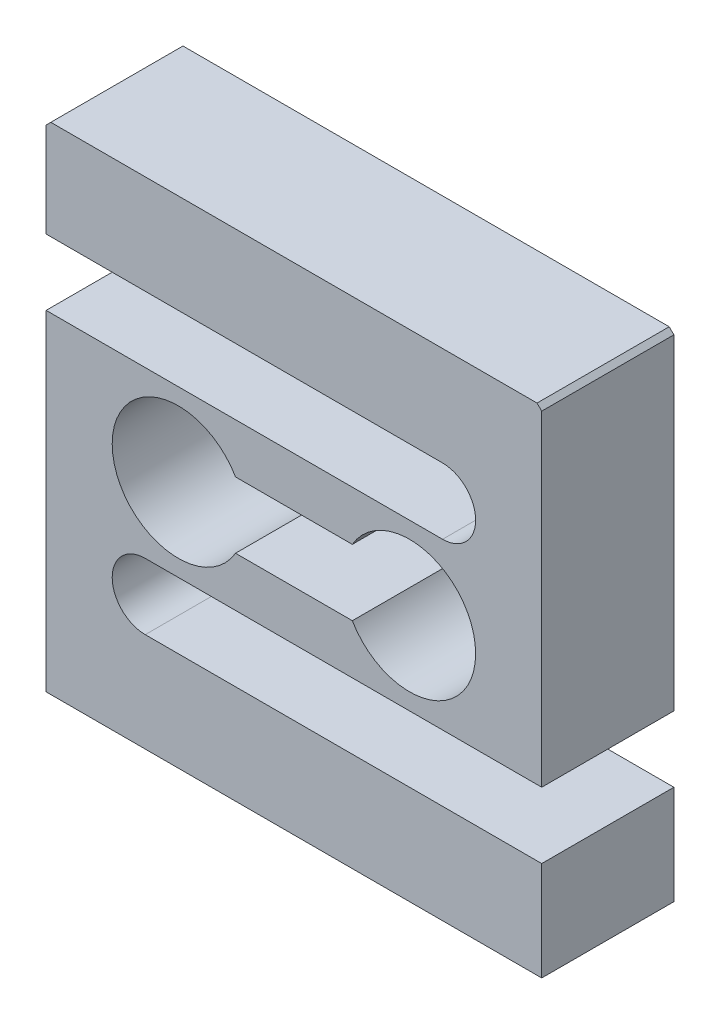
ISO-10303-21;
HEADER;
FILE_DESCRIPTION(('STEP AP214'),'2;1');
FILE_NAME('part.step','',(''),(''),'','','');
FILE_SCHEMA(('AUTOMOTIVE_DESIGN { 1 0 10303 214 1 1 1 1 }'));
ENDSEC;
DATA;
#1=APPLICATION_CONTEXT('core data for automotive mechanical design processes');
#2=APPLICATION_PROTOCOL_DEFINITION('international standard','automotive_design',2000,#1);
#3=PRODUCT_CONTEXT('',#1,'mechanical');
#4=PRODUCT('Part','Part','',(#3));
#5=PRODUCT_RELATED_PRODUCT_CATEGORY('part','',(#4));
#6=PRODUCT_DEFINITION_FORMATION('','',#4);
#7=PRODUCT_DEFINITION_CONTEXT('part definition',#1,'design');
#8=PRODUCT_DEFINITION('design','',#6,#7);
#9=PRODUCT_DEFINITION_SHAPE('','',#8);
#10=(LENGTH_UNIT() NAMED_UNIT(*) SI_UNIT(.MILLI.,.METRE.));
#11=(NAMED_UNIT(*) PLANE_ANGLE_UNIT() SI_UNIT($,.RADIAN.));
#12=(NAMED_UNIT(*) SI_UNIT($,.STERADIAN.) SOLID_ANGLE_UNIT());
#13=UNCERTAINTY_MEASURE_WITH_UNIT(LENGTH_MEASURE(1.E-05),#10,'distance_accuracy_value','');
#14=(GEOMETRIC_REPRESENTATION_CONTEXT(3) GLOBAL_UNCERTAINTY_ASSIGNED_CONTEXT((#13)) GLOBAL_UNIT_ASSIGNED_CONTEXT((#10,
#11,#12)) REPRESENTATION_CONTEXT('',''));
#15=CARTESIAN_POINT('',(0.,0.,0.));
#16=DIRECTION('',(0.,0.,1.));
#17=DIRECTION('',(1.,0.,0.));
#18=AXIS2_PLACEMENT_3D('',#15,#16,#17);
#19=CARTESIAN_POINT('',(15.,25.,20.));
#20=DIRECTION('',(0.,1.,0.));
#21=DIRECTION('',(0.,0.,1.));
#22=AXIS2_PLACEMENT_3D('',#19,#20,#21);
#23=PLANE('',#22);
#24=DIRECTION('',(1.,0.,0.));
#25=VECTOR('',#24,1.);
#26=CARTESIAN_POINT('',(15.,25.,0.));
#27=LINE('',#26,#25);
#28=CARTESIAN_POINT('',(15.,25.,0.));
#29=VERTEX_POINT('',#28);
#30=CARTESIAN_POINT('',(75.,25.,0.));
#31=VERTEX_POINT('',#30);
#32=EDGE_CURVE('E198',#29,#31,#27,.T.);
#33=ORIENTED_EDGE('',*,*,#32,.T.);
#34=DIRECTION('',(0.,0.,-1.));
#35=VECTOR('',#34,1.);
#36=CARTESIAN_POINT('',(75.,25.,20.));
#37=LINE('',#36,#35);
#38=CARTESIAN_POINT('',(75.,25.,20.));
#39=VERTEX_POINT('',#38);
#40=EDGE_CURVE('E11',#39,#31,#37,.T.);
#41=ORIENTED_EDGE('',*,*,#40,.F.);
#42=DIRECTION('',(1.,0.,0.));
#43=VECTOR('',#42,1.);
#44=CARTESIAN_POINT('',(15.,25.,20.));
#45=LINE('',#44,#43);
#46=CARTESIAN_POINT('',(15.,25.,20.));
#47=VERTEX_POINT('',#46);
#48=EDGE_CURVE('E202',#47,#39,#45,.T.);
#49=ORIENTED_EDGE('',*,*,#48,.F.);
#50=DIRECTION('',(0.,0.,-1.));
#51=VECTOR('',#50,1.);
#52=CARTESIAN_POINT('',(15.,25.,20.));
#53=LINE('',#52,#51);
#54=EDGE_CURVE('E232',#47,#29,#53,.T.);
#55=ORIENTED_EDGE('',*,*,#54,.T.);
#56=EDGE_LOOP('',(#33,#41,#49,#55));
#57=FACE_BOUND('',#56,.T.);
#58=ADVANCED_FACE('F41',(#57),#23,.F.);
#59=CARTESIAN_POINT('',(75.,25.,20.));
#60=DIRECTION('',(-1.,0.,0.));
#61=DIRECTION('',(0.,0.,1.));
#62=AXIS2_PLACEMENT_3D('',#59,#60,#61);
#63=PLANE('',#62);
#64=DIRECTION('',(0.,1.,0.));
#65=VECTOR('',#64,1.);
#66=CARTESIAN_POINT('',(75.,25.,0.));
#67=LINE('',#66,#65);
#68=CARTESIAN_POINT('',(75.,74.2928932188134,0.));
#69=VERTEX_POINT('',#68);
#70=EDGE_CURVE('E235',#31,#69,#67,.T.);
#71=ORIENTED_EDGE('',*,*,#70,.T.);
#72=DIRECTION('',(0.,0.,-1.));
#73=VECTOR('',#72,1.);
#74=CARTESIAN_POINT('',(75.,74.2928932188134,20.));
#75=LINE('',#74,#73);
#76=CARTESIAN_POINT('',(75.,74.2928932188134,20.));
#77=VERTEX_POINT('',#76);
#78=EDGE_CURVE('E48',#77,#69,#75,.T.);
#79=ORIENTED_EDGE('',*,*,#78,.F.);
#80=DIRECTION('',(0.,1.,0.));
#81=VECTOR('',#80,1.);
#82=CARTESIAN_POINT('',(75.,25.,20.));
#83=LINE('',#82,#81);
#84=EDGE_CURVE('E205',#39,#77,#83,.T.);
#85=ORIENTED_EDGE('',*,*,#84,.F.);
#86=ORIENTED_EDGE('',*,*,#40,.T.);
#87=EDGE_LOOP('',(#71,#79,#85,#86));
#88=FACE_BOUND('',#87,.T.);
#89=ADVANCED_FACE('F320',(#88),#63,.F.);
#90=CARTESIAN_POINT('',(75.,74.2928932188134,20.));
#91=DIRECTION('',(-0.707106781186548,-0.707106781186548,0.));
#92=DIRECTION('',(0.707106781186548,-0.707106781186548,0.));
#93=AXIS2_PLACEMENT_3D('',#90,#91,#92);
#94=PLANE('',#93);
#95=DIRECTION('',(-0.707106781186547,0.707106781186547,0.));
#96=VECTOR('',#95,1.);
#97=CARTESIAN_POINT('',(75.,74.2928932188134,0.));
#98=LINE('',#97,#96);
#99=CARTESIAN_POINT('',(74.2928932188134,75.,0.));
#100=VERTEX_POINT('',#99);
#101=EDGE_CURVE('E237',#69,#100,#98,.T.);
#102=ORIENTED_EDGE('',*,*,#101,.T.);
#103=DIRECTION('',(0.,0.,-1.));
#104=VECTOR('',#103,1.);
#105=CARTESIAN_POINT('',(74.2928932188134,75.,20.));
#106=LINE('',#105,#104);
#107=CARTESIAN_POINT('',(74.2928932188134,75.,20.));
#108=VERTEX_POINT('',#107);
#109=EDGE_CURVE('E292',#108,#100,#106,.T.);
#110=ORIENTED_EDGE('',*,*,#109,.F.);
#111=DIRECTION('',(-0.707106781186547,0.707106781186547,0.));
#112=VECTOR('',#111,1.);
#113=CARTESIAN_POINT('',(75.,74.2928932188134,20.));
#114=LINE('',#113,#112);
#115=EDGE_CURVE('E208',#77,#108,#114,.T.);
#116=ORIENTED_EDGE('',*,*,#115,.F.);
#117=ORIENTED_EDGE('',*,*,#78,.T.);
#118=EDGE_LOOP('',(#102,#110,#116,#117));
#119=FACE_BOUND('',#118,.T.);
#120=ADVANCED_FACE('F299',(#119),#94,.F.);
#121=CARTESIAN_POINT('',(74.2928932188134,75.,20.));
#122=DIRECTION('',(0.,-1.,0.));
#123=DIRECTION('',(1.,0.,0.));
#124=AXIS2_PLACEMENT_3D('',#121,#122,#123);
#125=PLANE('',#124);
#126=DIRECTION('',(-1.,0.,0.));
#127=VECTOR('',#126,1.);
#128=CARTESIAN_POINT('',(74.2928932188134,75.,0.));
#129=LINE('',#128,#127);
#130=CARTESIAN_POINT('',(0.707106781186552,75.,0.));
#131=VERTEX_POINT('',#130);
#132=EDGE_CURVE('E239',#100,#131,#129,.T.);
#133=ORIENTED_EDGE('',*,*,#132,.T.);
#134=DIRECTION('',(0.,0.,-1.));
#135=VECTOR('',#134,1.);
#136=CARTESIAN_POINT('',(0.707106781186552,75.,20.));
#137=LINE('',#136,#135);
#138=CARTESIAN_POINT('',(0.707106781186552,75.,20.));
#139=VERTEX_POINT('',#138);
#140=EDGE_CURVE('E289',#139,#131,#137,.T.);
#141=ORIENTED_EDGE('',*,*,#140,.F.);
#142=DIRECTION('',(-1.,0.,0.));
#143=VECTOR('',#142,1.);
#144=CARTESIAN_POINT('',(74.2928932188134,75.,20.));
#145=LINE('',#144,#143);
#146=EDGE_CURVE('E210',#108,#139,#145,.T.);
#147=ORIENTED_EDGE('',*,*,#146,.F.);
#148=ORIENTED_EDGE('',*,*,#109,.T.);
#149=EDGE_LOOP('',(#133,#141,#147,#148));
#150=FACE_BOUND('',#149,.T.);
#151=ADVANCED_FACE('F310',(#150),#125,.F.);
#152=CARTESIAN_POINT('',(0.707106781186552,75.,20.));
#153=DIRECTION('',(0.707106781186544,-0.707106781186551,0.));
#154=DIRECTION('',(0.707106781186551,0.707106781186544,0.));
#155=AXIS2_PLACEMENT_3D('',#152,#153,#154);
#156=PLANE('',#155);
#157=DIRECTION('',(-0.707106781186551,-0.707106781186544,0.));
#158=VECTOR('',#157,1.);
#159=CARTESIAN_POINT('',(0.707106781186552,75.,0.));
#160=LINE('',#159,#158);
#161=CARTESIAN_POINT('',(0.,74.2928932188134,0.));
#162=VERTEX_POINT('',#161);
#163=EDGE_CURVE('E241',#131,#162,#160,.T.);
#164=ORIENTED_EDGE('',*,*,#163,.T.);
#165=DIRECTION('',(0.,0.,-1.));
#166=VECTOR('',#165,1.);
#167=CARTESIAN_POINT('',(0.,74.2928932188134,20.));
#168=LINE('',#167,#166);
#169=CARTESIAN_POINT('',(0.,74.2928932188134,20.));
#170=VERTEX_POINT('',#169);
#171=EDGE_CURVE('E286',#170,#162,#168,.T.);
#172=ORIENTED_EDGE('',*,*,#171,.F.);
#173=DIRECTION('',(-0.707106781186551,-0.707106781186544,0.));
#174=VECTOR('',#173,1.);
#175=CARTESIAN_POINT('',(0.707106781186552,75.,20.));
#176=LINE('',#175,#174);
#177=EDGE_CURVE('E212',#139,#170,#176,.T.);
#178=ORIENTED_EDGE('',*,*,#177,.F.);
#179=ORIENTED_EDGE('',*,*,#140,.T.);
#180=EDGE_LOOP('',(#164,#172,#178,#179));
#181=FACE_BOUND('',#180,.T.);
#182=ADVANCED_FACE('F314',(#181),#156,.F.);
#183=CARTESIAN_POINT('',(0.,74.2928932188134,20.));
#184=DIRECTION('',(1.,0.,0.));
#185=DIRECTION('',(0.,1.,0.));
#186=AXIS2_PLACEMENT_3D('',#183,#184,#185);
#187=PLANE('',#186);
#188=DIRECTION('',(0.,-1.,0.));
#189=VECTOR('',#188,1.);
#190=CARTESIAN_POINT('',(0.,74.2928932188134,0.));
#191=LINE('',#190,#189);
#192=CARTESIAN_POINT('',(0.,60.,0.));
#193=VERTEX_POINT('',#192);
#194=EDGE_CURVE('E243',#162,#193,#191,.T.);
#195=ORIENTED_EDGE('',*,*,#194,.T.);
#196=DIRECTION('',(0.,0.,-1.));
#197=VECTOR('',#196,1.);
#198=CARTESIAN_POINT('',(0.,60.,20.));
#199=LINE('',#198,#197);
#200=CARTESIAN_POINT('',(0.,60.,20.));
#201=VERTEX_POINT('',#200);
#202=EDGE_CURVE('E283',#201,#193,#199,.T.);
#203=ORIENTED_EDGE('',*,*,#202,.F.);
#204=DIRECTION('',(0.,-1.,0.));
#205=VECTOR('',#204,1.);
#206=CARTESIAN_POINT('',(0.,74.2928932188134,20.));
#207=LINE('',#206,#205);
#208=EDGE_CURVE('E214',#170,#201,#207,.T.);
#209=ORIENTED_EDGE('',*,*,#208,.F.);
#210=ORIENTED_EDGE('',*,*,#171,.T.);
#211=EDGE_LOOP('',(#195,#203,#209,#210));
#212=FACE_BOUND('',#211,.T.);
#213=ADVANCED_FACE('F363',(#212),#187,.F.);
#214=CARTESIAN_POINT('',(0.,60.,20.));
#215=DIRECTION('',(0.,1.,0.));
#216=DIRECTION('',(0.,0.,1.));
#217=AXIS2_PLACEMENT_3D('',#214,#215,#216);
#218=PLANE('',#217);
#219=DIRECTION('',(1.,0.,0.));
#220=VECTOR('',#219,1.);
#221=CARTESIAN_POINT('',(0.,60.,0.));
#222=LINE('',#221,#220);
#223=CARTESIAN_POINT('',(60.,60.,0.));
#224=VERTEX_POINT('',#223);
#225=EDGE_CURVE('E245',#193,#224,#222,.T.);
#226=ORIENTED_EDGE('',*,*,#225,.T.);
#227=DIRECTION('',(0.,0.,-1.));
#228=VECTOR('',#227,1.);
#229=CARTESIAN_POINT('',(60.,60.,20.));
#230=LINE('',#229,#228);
#231=CARTESIAN_POINT('',(60.,60.,20.));
#232=VERTEX_POINT('',#231);
#233=EDGE_CURVE('E280',#232,#224,#230,.T.);
#234=ORIENTED_EDGE('',*,*,#233,.F.);
#235=DIRECTION('',(1.,0.,0.));
#236=VECTOR('',#235,1.);
#237=CARTESIAN_POINT('',(0.,60.,20.));
#238=LINE('',#237,#236);
#239=EDGE_CURVE('E216',#201,#232,#238,.T.);
#240=ORIENTED_EDGE('',*,*,#239,.F.);
#241=ORIENTED_EDGE('',*,*,#202,.T.);
#242=EDGE_LOOP('',(#226,#234,#240,#241));
#243=FACE_BOUND('',#242,.T.);
#244=ADVANCED_FACE('F361',(#243),#218,.F.);
#245=CARTESIAN_POINT('',(60.,55.,20.));
#246=DIRECTION('',(0.,0.,-1.));
#247=DIRECTION('',(-1.,0.,0.));
#248=AXIS2_PLACEMENT_3D('',#245,#246,#247);
#249=CYLINDRICAL_SURFACE('',#248,5.);
#250=CARTESIAN_POINT('',(60.,55.,0.));
#251=DIRECTION('',(0.,0.,-1.));
#252=DIRECTION('',(-1.,0.,0.));
#253=AXIS2_PLACEMENT_3D('',#250,#251,#252);
#254=CIRCLE('',#253,5.);
#255=CARTESIAN_POINT('',(60.,50.,0.));
#256=VERTEX_POINT('',#255);
#257=EDGE_CURVE('E247',#224,#256,#254,.T.);
#258=ORIENTED_EDGE('',*,*,#257,.T.);
#259=DIRECTION('',(0.,0.,-1.));
#260=VECTOR('',#259,1.);
#261=CARTESIAN_POINT('',(60.,50.,20.));
#262=LINE('',#261,#260);
#263=CARTESIAN_POINT('',(60.,50.,20.));
#264=VERTEX_POINT('',#263);
#265=EDGE_CURVE('E277',#264,#256,#262,.T.);
#266=ORIENTED_EDGE('',*,*,#265,.F.);
#267=CARTESIAN_POINT('',(60.,55.,20.));
#268=DIRECTION('',(0.,0.,-1.));
#269=DIRECTION('',(-1.,0.,0.));
#270=AXIS2_PLACEMENT_3D('',#267,#268,#269);
#271=CIRCLE('',#270,5.);
#272=EDGE_CURVE('E218',#232,#264,#271,.T.);
#273=ORIENTED_EDGE('',*,*,#272,.F.);
#274=ORIENTED_EDGE('',*,*,#233,.T.);
#275=EDGE_LOOP('',(#258,#266,#273,#274));
#276=FACE_BOUND('',#275,.T.);
#277=ADVANCED_FACE('F356',(#276),#249,.F.);
#278=CARTESIAN_POINT('',(60.,50.,20.));
#279=DIRECTION('',(0.,-1.,0.));
#280=DIRECTION('',(1.,0.,0.));
#281=AXIS2_PLACEMENT_3D('',#278,#279,#280);
#282=PLANE('',#281);
#283=DIRECTION('',(-1.,0.,0.));
#284=VECTOR('',#283,1.);
#285=CARTESIAN_POINT('',(60.,50.,0.));
#286=LINE('',#285,#284);
#287=CARTESIAN_POINT('',(0.,50.,0.));
#288=VERTEX_POINT('',#287);
#289=EDGE_CURVE('E249',#256,#288,#286,.T.);
#290=ORIENTED_EDGE('',*,*,#289,.T.);
#291=DIRECTION('',(0.,0.,-1.));
#292=VECTOR('',#291,1.);
#293=CARTESIAN_POINT('',(0.,50.,20.));
#294=LINE('',#293,#292);
#295=CARTESIAN_POINT('',(0.,50.,20.));
#296=VERTEX_POINT('',#295);
#297=EDGE_CURVE('E274',#296,#288,#294,.T.);
#298=ORIENTED_EDGE('',*,*,#297,.F.);
#299=DIRECTION('',(-1.,0.,0.));
#300=VECTOR('',#299,1.);
#301=CARTESIAN_POINT('',(60.,50.,20.));
#302=LINE('',#301,#300);
#303=EDGE_CURVE('E220',#264,#296,#302,.T.);
#304=ORIENTED_EDGE('',*,*,#303,.F.);
#305=ORIENTED_EDGE('',*,*,#265,.T.);
#306=EDGE_LOOP('',(#290,#298,#304,#305));
#307=FACE_BOUND('',#306,.T.);
#308=ADVANCED_FACE('F351',(#307),#282,.F.);
#309=CARTESIAN_POINT('',(0.,50.,20.));
#310=DIRECTION('',(1.,0.,0.));
#311=DIRECTION('',(0.,0.,-1.));
#312=AXIS2_PLACEMENT_3D('',#309,#310,#311);
#313=PLANE('',#312);
#314=DIRECTION('',(0.,-1.,0.));
#315=VECTOR('',#314,1.);
#316=CARTESIAN_POINT('',(0.,50.,0.));
#317=LINE('',#316,#315);
#318=CARTESIAN_POINT('',(0.,0.,0.));
#319=VERTEX_POINT('',#318);
#320=EDGE_CURVE('E251',#288,#319,#317,.T.);
#321=ORIENTED_EDGE('',*,*,#320,.T.);
#322=DIRECTION('',(0.,0.,-1.));
#323=VECTOR('',#322,1.);
#324=CARTESIAN_POINT('',(0.,0.,20.));
#325=LINE('',#324,#323);
#326=CARTESIAN_POINT('',(0.,0.,20.));
#327=VERTEX_POINT('',#326);
#328=EDGE_CURVE('E271',#327,#319,#325,.T.);
#329=ORIENTED_EDGE('',*,*,#328,.F.);
#330=DIRECTION('',(0.,-1.,0.));
#331=VECTOR('',#330,1.);
#332=CARTESIAN_POINT('',(0.,50.,20.));
#333=LINE('',#332,#331);
#334=EDGE_CURVE('E222',#296,#327,#333,.T.);
#335=ORIENTED_EDGE('',*,*,#334,.F.);
#336=ORIENTED_EDGE('',*,*,#297,.T.);
#337=EDGE_LOOP('',(#321,#329,#335,#336));
#338=FACE_BOUND('',#337,.T.);
#339=ADVANCED_FACE('F347',(#338),#313,.F.);
#340=CARTESIAN_POINT('',(0.,0.,20.));
#341=DIRECTION('',(0.,1.,0.));
#342=DIRECTION('',(0.,0.,1.));
#343=AXIS2_PLACEMENT_3D('',#340,#341,#342);
#344=PLANE('',#343);
#345=DIRECTION('',(1.,0.,0.));
#346=VECTOR('',#345,1.);
#347=CARTESIAN_POINT('',(0.,0.,0.));
#348=LINE('',#347,#346);
#349=CARTESIAN_POINT('',(75.,0.,0.));
#350=VERTEX_POINT('',#349);
#351=EDGE_CURVE('E253',#319,#350,#348,.T.);
#352=ORIENTED_EDGE('',*,*,#351,.T.);
#353=DIRECTION('',(0.,0.,-1.));
#354=VECTOR('',#353,1.);
#355=CARTESIAN_POINT('',(75.,0.,20.));
#356=LINE('',#355,#354);
#357=CARTESIAN_POINT('',(75.,0.,20.));
#358=VERTEX_POINT('',#357);
#359=EDGE_CURVE('E268',#358,#350,#356,.T.);
#360=ORIENTED_EDGE('',*,*,#359,.F.);
#361=DIRECTION('',(1.,0.,0.));
#362=VECTOR('',#361,1.);
#363=CARTESIAN_POINT('',(0.,0.,20.));
#364=LINE('',#363,#362);
#365=EDGE_CURVE('E224',#327,#358,#364,.T.);
#366=ORIENTED_EDGE('',*,*,#365,.F.);
#367=ORIENTED_EDGE('',*,*,#328,.T.);
#368=EDGE_LOOP('',(#352,#360,#366,#367));
#369=FACE_BOUND('',#368,.T.);
#370=ADVANCED_FACE('F342',(#369),#344,.F.);
#371=CARTESIAN_POINT('',(75.,0.,20.));
#372=DIRECTION('',(-1.,0.,0.));
#373=DIRECTION('',(0.,0.,1.));
#374=AXIS2_PLACEMENT_3D('',#371,#372,#373);
#375=PLANE('',#374);
#376=DIRECTION('',(0.,1.,0.));
#377=VECTOR('',#376,1.);
#378=CARTESIAN_POINT('',(75.,0.,0.));
#379=LINE('',#378,#377);
#380=CARTESIAN_POINT('',(75.,15.,0.));
#381=VERTEX_POINT('',#380);
#382=EDGE_CURVE('E255',#350,#381,#379,.T.);
#383=ORIENTED_EDGE('',*,*,#382,.T.);
#384=DIRECTION('',(0.,0.,-1.));
#385=VECTOR('',#384,1.);
#386=CARTESIAN_POINT('',(75.,15.,20.));
#387=LINE('',#386,#385);
#388=CARTESIAN_POINT('',(75.,15.,20.));
#389=VERTEX_POINT('',#388);
#390=EDGE_CURVE('E265',#389,#381,#387,.T.);
#391=ORIENTED_EDGE('',*,*,#390,.F.);
#392=DIRECTION('',(0.,1.,0.));
#393=VECTOR('',#392,1.);
#394=CARTESIAN_POINT('',(75.,0.,20.));
#395=LINE('',#394,#393);
#396=EDGE_CURVE('E226',#358,#389,#395,.T.);
#397=ORIENTED_EDGE('',*,*,#396,.F.);
#398=ORIENTED_EDGE('',*,*,#359,.T.);
#399=EDGE_LOOP('',(#383,#391,#397,#398));
#400=FACE_BOUND('',#399,.T.);
#401=ADVANCED_FACE('F336',(#400),#375,.F.);
#402=CARTESIAN_POINT('',(75.,15.,20.));
#403=DIRECTION('',(0.,-1.,0.));
#404=DIRECTION('',(1.,0.,0.));
#405=AXIS2_PLACEMENT_3D('',#402,#403,#404);
#406=PLANE('',#405);
#407=DIRECTION('',(-1.,0.,0.));
#408=VECTOR('',#407,1.);
#409=CARTESIAN_POINT('',(75.,15.,0.));
#410=LINE('',#409,#408);
#411=CARTESIAN_POINT('',(15.,15.,0.));
#412=VERTEX_POINT('',#411);
#413=EDGE_CURVE('E257',#381,#412,#410,.T.);
#414=ORIENTED_EDGE('',*,*,#413,.T.);
#415=DIRECTION('',(0.,0.,-1.));
#416=VECTOR('',#415,1.);
#417=CARTESIAN_POINT('',(15.,15.,20.));
#418=LINE('',#417,#416);
#419=CARTESIAN_POINT('',(15.,15.,20.));
#420=VERTEX_POINT('',#419);
#421=EDGE_CURVE('E262',#420,#412,#418,.T.);
#422=ORIENTED_EDGE('',*,*,#421,.F.);
#423=DIRECTION('',(-1.,0.,0.));
#424=VECTOR('',#423,1.);
#425=CARTESIAN_POINT('',(75.,15.,20.));
#426=LINE('',#425,#424);
#427=EDGE_CURVE('E228',#389,#420,#426,.T.);
#428=ORIENTED_EDGE('',*,*,#427,.F.);
#429=ORIENTED_EDGE('',*,*,#390,.T.);
#430=EDGE_LOOP('',(#414,#422,#428,#429));
#431=FACE_BOUND('',#430,.T.);
#432=ADVANCED_FACE('F332',(#431),#406,.F.);
#433=CARTESIAN_POINT('',(15.,20.,20.));
#434=DIRECTION('',(0.,0.,-1.));
#435=DIRECTION('',(-1.,0.,0.));
#436=AXIS2_PLACEMENT_3D('',#433,#434,#435);
#437=CYLINDRICAL_SURFACE('',#436,5.);
#438=CARTESIAN_POINT('',(15.,20.,0.));
#439=DIRECTION('',(0.,0.,-1.));
#440=DIRECTION('',(-1.,0.,0.));
#441=AXIS2_PLACEMENT_3D('',#438,#439,#440);
#442=CIRCLE('',#441,5.);
#443=EDGE_CURVE('E206',#412,#29,#442,.T.);
#444=ORIENTED_EDGE('',*,*,#443,.T.);
#445=ORIENTED_EDGE('',*,*,#54,.F.);
#446=CARTESIAN_POINT('',(15.,20.,20.));
#447=DIRECTION('',(0.,0.,-1.));
#448=DIRECTION('',(-1.,0.,0.));
#449=AXIS2_PLACEMENT_3D('',#446,#447,#448);
#450=CIRCLE('',#449,5.);
#451=EDGE_CURVE('E230',#420,#47,#450,.T.);
#452=ORIENTED_EDGE('',*,*,#451,.F.);
#453=ORIENTED_EDGE('',*,*,#421,.T.);
#454=EDGE_LOOP('',(#444,#445,#452,#453));
#455=FACE_BOUND('',#454,.T.);
#456=ADVANCED_FACE('F327',(#455),#437,.F.);
#457=CARTESIAN_POINT('',(60.,55.,20.));
#458=DIRECTION('',(0.,0.,-1.));
#459=DIRECTION('',(-1.,0.,0.));
#460=AXIS2_PLACEMENT_3D('',#457,#458,#459);
#461=PLANE('',#460);
#462=DIRECTION('',(-1.,0.,0.));
#463=VECTOR('',#462,1.);
#464=CARTESIAN_POINT('',(46.3397459621556,32.5,20.));
#465=LINE('',#464,#463);
#466=CARTESIAN_POINT('',(46.3397459621556,32.5,20.));
#467=VERTEX_POINT('',#466);
#468=CARTESIAN_POINT('',(28.6602540378444,32.5,20.));
#469=VERTEX_POINT('',#468);
#470=EDGE_CURVE('E173',#467,#469,#465,.T.);
#471=ORIENTED_EDGE('',*,*,#470,.T.);
#472=CARTESIAN_POINT('',(20.,37.5,20.));
#473=DIRECTION('',(0.,0.,-1.));
#474=DIRECTION('',(-1.,0.,0.));
#475=AXIS2_PLACEMENT_3D('',#472,#473,#474);
#476=CIRCLE('',#475,10.);
#477=CARTESIAN_POINT('',(28.6602540378444,42.5,20.));
#478=VERTEX_POINT('',#477);
#479=EDGE_CURVE('E167',#469,#478,#476,.T.);
#480=ORIENTED_EDGE('',*,*,#479,.T.);
#481=DIRECTION('',(1.,0.,0.));
#482=VECTOR('',#481,1.);
#483=CARTESIAN_POINT('',(28.6602540378444,42.5,20.));
#484=LINE('',#483,#482);
#485=CARTESIAN_POINT('',(46.3397459621556,42.5,20.));
#486=VERTEX_POINT('',#485);
#487=EDGE_CURVE('E176',#478,#486,#484,.T.);
#488=ORIENTED_EDGE('',*,*,#487,.T.);
#489=CARTESIAN_POINT('',(55.,37.5,20.));
#490=DIRECTION('',(0.,0.,-1.));
#491=DIRECTION('',(-1.,0.,0.));
#492=AXIS2_PLACEMENT_3D('',#489,#490,#491);
#493=CIRCLE('',#492,10.);
#494=EDGE_CURVE('E55',#486,#467,#493,.T.);
#495=ORIENTED_EDGE('',*,*,#494,.T.);
#496=EDGE_LOOP('',(#471,#480,#488,#495));
#497=FACE_BOUND('',#496,.T.);
#498=ORIENTED_EDGE('',*,*,#48,.T.);
#499=ORIENTED_EDGE('',*,*,#84,.T.);
#500=ORIENTED_EDGE('',*,*,#115,.T.);
#501=ORIENTED_EDGE('',*,*,#146,.T.);
#502=ORIENTED_EDGE('',*,*,#177,.T.);
#503=ORIENTED_EDGE('',*,*,#208,.T.);
#504=ORIENTED_EDGE('',*,*,#239,.T.);
#505=ORIENTED_EDGE('',*,*,#272,.T.);
#506=ORIENTED_EDGE('',*,*,#303,.T.);
#507=ORIENTED_EDGE('',*,*,#334,.T.);
#508=ORIENTED_EDGE('',*,*,#365,.T.);
#509=ORIENTED_EDGE('',*,*,#396,.T.);
#510=ORIENTED_EDGE('',*,*,#427,.T.);
#511=ORIENTED_EDGE('',*,*,#451,.T.);
#512=EDGE_LOOP('',(#498,#499,#500,#501,#502,#503,#504,#505,#506,#507,#508,#509,#510,#511));
#513=FACE_BOUND('',#512,.T.);
#514=ADVANCED_FACE('F180',(#497,#513),#461,.F.);
#515=CARTESIAN_POINT('',(60.,55.,0.));
#516=DIRECTION('',(0.,0.,-1.));
#517=DIRECTION('',(-1.,0.,0.));
#518=AXIS2_PLACEMENT_3D('',#515,#516,#517);
#519=PLANE('',#518);
#520=CARTESIAN_POINT('',(20.,37.5,0.));
#521=DIRECTION('',(0.,0.,-1.));
#522=DIRECTION('',(-1.,0.,0.));
#523=AXIS2_PLACEMENT_3D('',#520,#521,#522);
#524=CIRCLE('',#523,10.);
#525=CARTESIAN_POINT('',(28.6602540378444,32.5,0.));
#526=VERTEX_POINT('',#525);
#527=CARTESIAN_POINT('',(28.6602540378444,42.5,0.));
#528=VERTEX_POINT('',#527);
#529=EDGE_CURVE('E63',#526,#528,#524,.T.);
#530=ORIENTED_EDGE('',*,*,#529,.F.);
#531=DIRECTION('',(-1.,0.,0.));
#532=VECTOR('',#531,1.);
#533=CARTESIAN_POINT('',(46.3397459621556,32.5,0.));
#534=LINE('',#533,#532);
#535=CARTESIAN_POINT('',(46.3397459621556,32.5,0.));
#536=VERTEX_POINT('',#535);
#537=EDGE_CURVE('E183',#536,#526,#534,.T.);
#538=ORIENTED_EDGE('',*,*,#537,.F.);
#539=CARTESIAN_POINT('',(55.,37.5,0.));
#540=DIRECTION('',(0.,0.,-1.));
#541=DIRECTION('',(-1.,0.,0.));
#542=AXIS2_PLACEMENT_3D('',#539,#540,#541);
#543=CIRCLE('',#542,10.);
#544=CARTESIAN_POINT('',(46.3397459621556,42.5,0.));
#545=VERTEX_POINT('',#544);
#546=EDGE_CURVE('E186',#545,#536,#543,.T.);
#547=ORIENTED_EDGE('',*,*,#546,.F.);
#548=DIRECTION('',(1.,0.,0.));
#549=VECTOR('',#548,1.);
#550=CARTESIAN_POINT('',(28.6602540378444,42.5,0.));
#551=LINE('',#550,#549);
#552=EDGE_CURVE('E192',#528,#545,#551,.T.);
#553=ORIENTED_EDGE('',*,*,#552,.F.);
#554=EDGE_LOOP('',(#530,#538,#547,#553));
#555=FACE_BOUND('',#554,.T.);
#556=ORIENTED_EDGE('',*,*,#32,.F.);
#557=ORIENTED_EDGE('',*,*,#443,.F.);
#558=ORIENTED_EDGE('',*,*,#413,.F.);
#559=ORIENTED_EDGE('',*,*,#382,.F.);
#560=ORIENTED_EDGE('',*,*,#351,.F.);
#561=ORIENTED_EDGE('',*,*,#320,.F.);
#562=ORIENTED_EDGE('',*,*,#289,.F.);
#563=ORIENTED_EDGE('',*,*,#257,.F.);
#564=ORIENTED_EDGE('',*,*,#225,.F.);
#565=ORIENTED_EDGE('',*,*,#194,.F.);
#566=ORIENTED_EDGE('',*,*,#163,.F.);
#567=ORIENTED_EDGE('',*,*,#132,.F.);
#568=ORIENTED_EDGE('',*,*,#101,.F.);
#569=ORIENTED_EDGE('',*,*,#70,.F.);
#570=EDGE_LOOP('',(#556,#557,#558,#559,#560,#561,#562,#563,#564,#565,#566,#567,#568,#569));
#571=FACE_BOUND('',#570,.T.);
#572=ADVANCED_FACE('F305',(#555,#571),#519,.T.);
#573=CARTESIAN_POINT('',(20.,37.5,20.));
#574=DIRECTION('',(0.,0.,-1.));
#575=DIRECTION('',(-1.,0.,0.));
#576=AXIS2_PLACEMENT_3D('',#573,#574,#575);
#577=CYLINDRICAL_SURFACE('',#576,10.);
#578=ORIENTED_EDGE('',*,*,#529,.T.);
#579=DIRECTION('',(0.,0.,-1.));
#580=VECTOR('',#579,1.);
#581=CARTESIAN_POINT('',(28.6602540378444,42.5,20.));
#582=LINE('',#581,#580);
#583=EDGE_CURVE('E163',#478,#528,#582,.T.);
#584=ORIENTED_EDGE('',*,*,#583,.F.);
#585=ORIENTED_EDGE('',*,*,#479,.F.);
#586=DIRECTION('',(0.,0.,-1.));
#587=VECTOR('',#586,1.);
#588=CARTESIAN_POINT('',(28.6602540378444,32.5,20.));
#589=LINE('',#588,#587);
#590=EDGE_CURVE('E196',#469,#526,#589,.T.);
#591=ORIENTED_EDGE('',*,*,#590,.T.);
#592=EDGE_LOOP('',(#578,#584,#585,#591));
#593=FACE_BOUND('',#592,.T.);
#594=ADVANCED_FACE('F165',(#593),#577,.F.);
#595=CARTESIAN_POINT('',(46.3397459621556,32.5,20.));
#596=DIRECTION('',(0.,-1.,0.));
#597=DIRECTION('',(1.,0.,0.));
#598=AXIS2_PLACEMENT_3D('',#595,#596,#597);
#599=PLANE('',#598);
#600=ORIENTED_EDGE('',*,*,#537,.T.);
#601=ORIENTED_EDGE('',*,*,#590,.F.);
#602=ORIENTED_EDGE('',*,*,#470,.F.);
#603=DIRECTION('',(0.,0.,-1.));
#604=VECTOR('',#603,1.);
#605=CARTESIAN_POINT('',(46.3397459621556,32.5,20.));
#606=LINE('',#605,#604);
#607=EDGE_CURVE('E199',#467,#536,#606,.T.);
#608=ORIENTED_EDGE('',*,*,#607,.T.);
#609=EDGE_LOOP('',(#600,#601,#602,#608));
#610=FACE_BOUND('',#609,.T.);
#611=ADVANCED_FACE('F483',(#610),#599,.F.);
#612=CARTESIAN_POINT('',(55.,37.5,20.));
#613=DIRECTION('',(0.,0.,-1.));
#614=DIRECTION('',(-1.,0.,0.));
#615=AXIS2_PLACEMENT_3D('',#612,#613,#614);
#616=CYLINDRICAL_SURFACE('',#615,10.);
#617=ORIENTED_EDGE('',*,*,#546,.T.);
#618=ORIENTED_EDGE('',*,*,#607,.F.);
#619=ORIENTED_EDGE('',*,*,#494,.F.);
#620=DIRECTION('',(0.,0.,-1.));
#621=VECTOR('',#620,1.);
#622=CARTESIAN_POINT('',(46.3397459621556,42.5,20.));
#623=LINE('',#622,#621);
#624=EDGE_CURVE('E172',#486,#545,#623,.T.);
#625=ORIENTED_EDGE('',*,*,#624,.T.);
#626=EDGE_LOOP('',(#617,#618,#619,#625));
#627=FACE_BOUND('',#626,.T.);
#628=ADVANCED_FACE('F492',(#627),#616,.F.);
#629=CARTESIAN_POINT('',(28.6602540378444,42.5,20.));
#630=DIRECTION('',(0.,1.,0.));
#631=DIRECTION('',(-1.,0.,0.));
#632=AXIS2_PLACEMENT_3D('',#629,#630,#631);
#633=PLANE('',#632);
#634=ORIENTED_EDGE('',*,*,#552,.T.);
#635=ORIENTED_EDGE('',*,*,#624,.F.);
#636=ORIENTED_EDGE('',*,*,#487,.F.);
#637=ORIENTED_EDGE('',*,*,#583,.T.);
#638=EDGE_LOOP('',(#634,#635,#636,#637));
#639=FACE_BOUND('',#638,.T.);
#640=ADVANCED_FACE('F177',(#639),#633,.F.);
#641=CLOSED_SHELL('',(#58,#89,#120,#151,#182,#213,#244,#277,#308,#339,#370,#401,#432,#456,#514,
#572,#594,#611,#628,#640));
#642=MANIFOLD_SOLID_BREP('B2',#641);
#643=ADVANCED_BREP_SHAPE_REPRESENTATION('',(#18,#642),#14);
#644=SHAPE_DEFINITION_REPRESENTATION(#9,#643);
ENDSEC;
END-ISO-10303-21;
